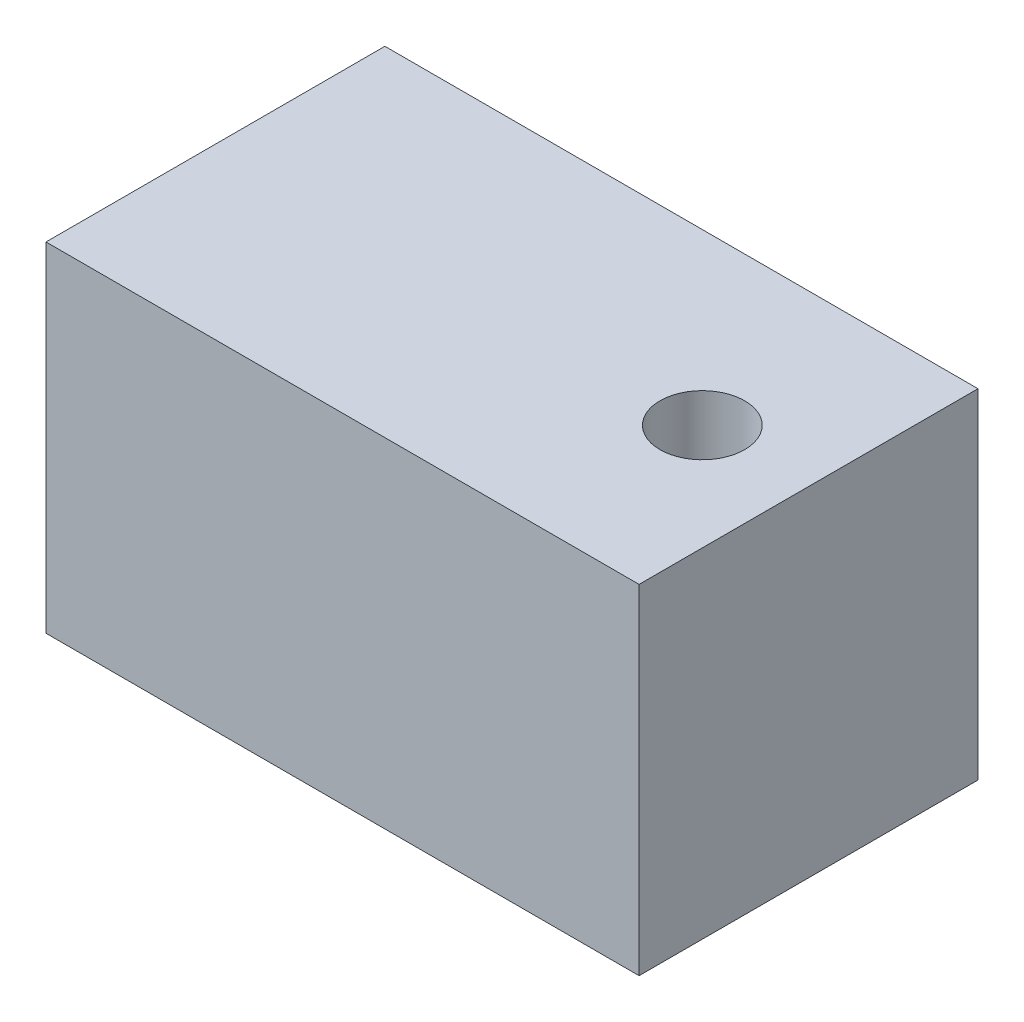
ISO-10303-21;
HEADER;
FILE_DESCRIPTION(('STEP AP214'),'2;1');
FILE_NAME('part.step','',(''),(''),'','','');
FILE_SCHEMA(('AUTOMOTIVE_DESIGN { 1 0 10303 214 1 1 1 1 }'));
ENDSEC;
DATA;
#1=APPLICATION_CONTEXT('core data for automotive mechanical design processes');
#2=APPLICATION_PROTOCOL_DEFINITION('international standard','automotive_design',2000,#1);
#3=PRODUCT_CONTEXT('',#1,'mechanical');
#4=PRODUCT('Part','Part','',(#3));
#5=PRODUCT_RELATED_PRODUCT_CATEGORY('part','',(#4));
#6=PRODUCT_DEFINITION_FORMATION('','',#4);
#7=PRODUCT_DEFINITION_CONTEXT('part definition',#1,'design');
#8=PRODUCT_DEFINITION('design','',#6,#7);
#9=PRODUCT_DEFINITION_SHAPE('','',#8);
#10=(LENGTH_UNIT() NAMED_UNIT(*) SI_UNIT(.MILLI.,.METRE.));
#11=(NAMED_UNIT(*) PLANE_ANGLE_UNIT() SI_UNIT($,.RADIAN.));
#12=(NAMED_UNIT(*) SI_UNIT($,.STERADIAN.) SOLID_ANGLE_UNIT());
#13=UNCERTAINTY_MEASURE_WITH_UNIT(LENGTH_MEASURE(1.E-05),#10,'distance_accuracy_value','');
#14=(GEOMETRIC_REPRESENTATION_CONTEXT(3) GLOBAL_UNCERTAINTY_ASSIGNED_CONTEXT((#13)) GLOBAL_UNIT_ASSIGNED_CONTEXT((#10,
#11,#12)) REPRESENTATION_CONTEXT('',''));
#15=CARTESIAN_POINT('',(0.,0.,0.));
#16=DIRECTION('',(0.,0.,1.));
#17=DIRECTION('',(1.,0.,0.));
#18=AXIS2_PLACEMENT_3D('',#15,#16,#17);
#19=CARTESIAN_POINT('',(0.,25.4,0.));
#20=DIRECTION('',(1.,0.,0.));
#21=DIRECTION('',(0.,0.,-1.));
#22=AXIS2_PLACEMENT_3D('',#19,#20,#21);
#23=PLANE('',#22);
#24=CARTESIAN_POINT('',(0.,12.7,-12.7));
#25=DIRECTION('',(-1.,0.,0.));
#26=DIRECTION('',(0.,0.,1.));
#27=AXIS2_PLACEMENT_3D('',#24,#25,#26);
#28=CIRCLE('',#27,3.96874999999999);
#29=CARTESIAN_POINT('',(0.,12.7,-8.73125000000001));
#30=VERTEX_POINT('',#29);
#31=EDGE_CURVE('E113',#30,#30,#28,.T.);
#32=ORIENTED_EDGE('',*,*,#31,.F.);
#33=EDGE_LOOP('',(#32));
#34=FACE_BOUND('',#33,.T.);
#35=DIRECTION('',(0.,0.,1.));
#36=VECTOR('',#35,1.);
#37=CARTESIAN_POINT('',(0.,0.,0.));
#38=LINE('',#37,#36);
#39=CARTESIAN_POINT('',(0.,0.,-25.4));
#40=VERTEX_POINT('',#39);
#41=CARTESIAN_POINT('',(0.,0.,0.));
#42=VERTEX_POINT('',#41);
#43=EDGE_CURVE('E126',#40,#42,#38,.T.);
#44=ORIENTED_EDGE('',*,*,#43,.T.);
#45=DIRECTION('',(0.,-1.,0.));
#46=VECTOR('',#45,1.);
#47=CARTESIAN_POINT('',(0.,25.4,0.));
#48=LINE('',#47,#46);
#49=CARTESIAN_POINT('',(0.,25.4,0.));
#50=VERTEX_POINT('',#49);
#51=EDGE_CURVE('E11',#50,#42,#48,.T.);
#52=ORIENTED_EDGE('',*,*,#51,.F.);
#53=DIRECTION('',(0.,0.,1.));
#54=VECTOR('',#53,1.);
#55=CARTESIAN_POINT('',(0.,25.4,0.));
#56=LINE('',#55,#54);
#57=CARTESIAN_POINT('',(0.,25.4,-25.4));
#58=VERTEX_POINT('',#57);
#59=EDGE_CURVE('E128',#58,#50,#56,.T.);
#60=ORIENTED_EDGE('',*,*,#59,.F.);
#61=DIRECTION('',(0.,-1.,0.));
#62=VECTOR('',#61,1.);
#63=CARTESIAN_POINT('',(0.,25.4,-25.4));
#64=LINE('',#63,#62);
#65=EDGE_CURVE('E138',#58,#40,#64,.T.);
#66=ORIENTED_EDGE('',*,*,#65,.T.);
#67=EDGE_LOOP('',(#44,#52,#60,#66));
#68=FACE_BOUND('',#67,.T.);
#69=ADVANCED_FACE('F49',(#34,#68),#23,.F.);
#70=CARTESIAN_POINT('',(0.,25.4,0.));
#71=DIRECTION('',(0.,0.,-1.));
#72=DIRECTION('',(-1.,0.,0.));
#73=AXIS2_PLACEMENT_3D('',#70,#71,#72);
#74=PLANE('',#73);
#75=DIRECTION('',(1.,0.,0.));
#76=VECTOR('',#75,1.);
#77=CARTESIAN_POINT('',(0.,0.,0.));
#78=LINE('',#77,#76);
#79=CARTESIAN_POINT('',(44.45,0.,0.));
#80=VERTEX_POINT('',#79);
#81=EDGE_CURVE('E142',#42,#80,#78,.T.);
#82=ORIENTED_EDGE('',*,*,#81,.T.);
#83=DIRECTION('',(0.,-1.,0.));
#84=VECTOR('',#83,1.);
#85=CARTESIAN_POINT('',(44.45,25.4,0.));
#86=LINE('',#85,#84);
#87=CARTESIAN_POINT('',(44.45,25.4,0.));
#88=VERTEX_POINT('',#87);
#89=EDGE_CURVE('E58',#88,#80,#86,.T.);
#90=ORIENTED_EDGE('',*,*,#89,.F.);
#91=DIRECTION('',(1.,0.,0.));
#92=VECTOR('',#91,1.);
#93=CARTESIAN_POINT('',(0.,25.4,0.));
#94=LINE('',#93,#92);
#95=EDGE_CURVE('E97',#50,#88,#94,.T.);
#96=ORIENTED_EDGE('',*,*,#95,.F.);
#97=ORIENTED_EDGE('',*,*,#51,.T.);
#98=EDGE_LOOP('',(#82,#90,#96,#97));
#99=FACE_BOUND('',#98,.T.);
#100=ADVANCED_FACE('F173',(#99),#74,.F.);
#101=CARTESIAN_POINT('',(44.45,25.4,0.));
#102=DIRECTION('',(-1.,0.,0.));
#103=DIRECTION('',(0.,0.,1.));
#104=AXIS2_PLACEMENT_3D('',#101,#102,#103);
#105=PLANE('',#104);
#106=DIRECTION('',(0.,0.,-1.));
#107=VECTOR('',#106,1.);
#108=CARTESIAN_POINT('',(44.45,0.,0.));
#109=LINE('',#108,#107);
#110=CARTESIAN_POINT('',(44.45,0.,-25.4));
#111=VERTEX_POINT('',#110);
#112=EDGE_CURVE('E84',#80,#111,#109,.T.);
#113=ORIENTED_EDGE('',*,*,#112,.T.);
#114=DIRECTION('',(0.,-1.,0.));
#115=VECTOR('',#114,1.);
#116=CARTESIAN_POINT('',(44.45,25.4,-25.4));
#117=LINE('',#116,#115);
#118=CARTESIAN_POINT('',(44.45,25.4,-25.4));
#119=VERTEX_POINT('',#118);
#120=EDGE_CURVE('E151',#119,#111,#117,.T.);
#121=ORIENTED_EDGE('',*,*,#120,.F.);
#122=DIRECTION('',(0.,0.,-1.));
#123=VECTOR('',#122,1.);
#124=CARTESIAN_POINT('',(44.45,25.4,0.));
#125=LINE('',#124,#123);
#126=EDGE_CURVE('E133',#88,#119,#125,.T.);
#127=ORIENTED_EDGE('',*,*,#126,.F.);
#128=ORIENTED_EDGE('',*,*,#89,.T.);
#129=EDGE_LOOP('',(#113,#121,#127,#128));
#130=FACE_BOUND('',#129,.T.);
#131=ADVANCED_FACE('F156',(#130),#105,.F.);
#132=CARTESIAN_POINT('',(0.,25.4,-25.4));
#133=DIRECTION('',(0.,0.,1.));
#134=DIRECTION('',(1.,0.,0.));
#135=AXIS2_PLACEMENT_3D('',#132,#133,#134);
#136=PLANE('',#135);
#137=DIRECTION('',(-1.,0.,0.));
#138=VECTOR('',#137,1.);
#139=CARTESIAN_POINT('',(0.,0.,-25.4));
#140=LINE('',#139,#138);
#141=EDGE_CURVE('E90',#111,#40,#140,.T.);
#142=ORIENTED_EDGE('',*,*,#141,.T.);
#143=ORIENTED_EDGE('',*,*,#65,.F.);
#144=DIRECTION('',(-1.,0.,0.));
#145=VECTOR('',#144,1.);
#146=CARTESIAN_POINT('',(0.,25.4,-25.4));
#147=LINE('',#146,#145);
#148=EDGE_CURVE('E66',#119,#58,#147,.T.);
#149=ORIENTED_EDGE('',*,*,#148,.F.);
#150=ORIENTED_EDGE('',*,*,#120,.T.);
#151=EDGE_LOOP('',(#142,#143,#149,#150));
#152=FACE_BOUND('',#151,.T.);
#153=ADVANCED_FACE('F163',(#152),#136,.F.);
#154=CARTESIAN_POINT('',(0.,25.4,0.));
#155=DIRECTION('',(0.,-1.,0.));
#156=DIRECTION('',(0.,0.,-1.));
#157=AXIS2_PLACEMENT_3D('',#154,#155,#156);
#158=PLANE('',#157);
#159=CARTESIAN_POINT('',(36.48842715,25.4,-12.7));
#160=DIRECTION('',(0.,1.,0.));
#161=DIRECTION('',(0.,0.,1.));
#162=AXIS2_PLACEMENT_3D('',#159,#160,#161);
#163=CIRCLE('',#162,3.175);
#164=CARTESIAN_POINT('',(36.48842715,25.4,-9.525));
#165=VERTEX_POINT('',#164);
#166=EDGE_CURVE('E112',#165,#165,#163,.T.);
#167=ORIENTED_EDGE('',*,*,#166,.F.);
#168=EDGE_LOOP('',(#167));
#169=FACE_BOUND('',#168,.T.);
#170=ORIENTED_EDGE('',*,*,#59,.T.);
#171=ORIENTED_EDGE('',*,*,#95,.T.);
#172=ORIENTED_EDGE('',*,*,#126,.T.);
#173=ORIENTED_EDGE('',*,*,#148,.T.);
#174=EDGE_LOOP('',(#170,#171,#172,#173));
#175=FACE_BOUND('',#174,.T.);
#176=ADVANCED_FACE('F165',(#169,#175),#158,.F.);
#177=CARTESIAN_POINT('',(0.,0.,0.));
#178=DIRECTION('',(0.,-1.,0.));
#179=DIRECTION('',(0.,0.,-1.));
#180=AXIS2_PLACEMENT_3D('',#177,#178,#179);
#181=PLANE('',#180);
#182=CARTESIAN_POINT('',(36.48842715,0.,-12.7));
#183=DIRECTION('',(0.,1.,0.));
#184=DIRECTION('',(0.,0.,1.));
#185=AXIS2_PLACEMENT_3D('',#182,#183,#184);
#186=CIRCLE('',#185,3.175);
#187=CARTESIAN_POINT('',(36.48842715,0.,-9.525));
#188=VERTEX_POINT('',#187);
#189=EDGE_CURVE('E119',#188,#188,#186,.T.);
#190=ORIENTED_EDGE('',*,*,#189,.T.);
#191=EDGE_LOOP('',(#190));
#192=FACE_BOUND('',#191,.T.);
#193=ORIENTED_EDGE('',*,*,#43,.F.);
#194=ORIENTED_EDGE('',*,*,#141,.F.);
#195=ORIENTED_EDGE('',*,*,#112,.F.);
#196=ORIENTED_EDGE('',*,*,#81,.F.);
#197=EDGE_LOOP('',(#193,#194,#195,#196));
#198=FACE_BOUND('',#197,.T.);
#199=ADVANCED_FACE('F159',(#192,#198),#181,.T.);
#200=CARTESIAN_POINT('',(36.48842715,0.,-12.7));
#201=DIRECTION('',(0.,1.,0.));
#202=DIRECTION('',(0.,0.,1.));
#203=AXIS2_PLACEMENT_3D('',#200,#201,#202);
#204=CYLINDRICAL_SURFACE('',#203,3.175);
#205=ORIENTED_EDGE('',*,*,#189,.F.);
#206=EDGE_LOOP('',(#205));
#207=FACE_BOUND('',#206,.T.);
#208=ORIENTED_EDGE('',*,*,#166,.T.);
#209=EDGE_LOOP('',(#208));
#210=FACE_BOUND('',#209,.T.);
#211=ADVANCED_FACE('F105',(#207,#210),#204,.F.);
#212=CARTESIAN_POINT('',(25.4,12.7,-12.7));
#213=DIRECTION('',(-1.,0.,0.));
#214=DIRECTION('',(0.,0.,1.));
#215=AXIS2_PLACEMENT_3D('',#212,#213,#214);
#216=CONICAL_SURFACE('',#215,3.96875,1.02974425867665);
#217=CARTESIAN_POINT('',(27.7846655817656,12.7,-12.7));
#218=VERTEX_POINT('',#217);
#219=VERTEX_LOOP('',#218);
#220=FACE_BOUND('',#219,.T.);
#221=CARTESIAN_POINT('',(25.4,12.7,-12.7));
#222=DIRECTION('',(-1.,0.,0.));
#223=DIRECTION('',(0.,0.,1.));
#224=AXIS2_PLACEMENT_3D('',#221,#222,#223);
#225=CIRCLE('',#224,3.96875);
#226=CARTESIAN_POINT('',(25.4,12.7,-8.73125));
#227=VERTEX_POINT('',#226);
#228=EDGE_CURVE('E109',#227,#227,#225,.T.);
#229=ORIENTED_EDGE('',*,*,#228,.T.);
#230=EDGE_LOOP('',(#229));
#231=FACE_BOUND('',#230,.T.);
#232=ADVANCED_FACE('F101',(#220,#231),#216,.F.);
#233=CARTESIAN_POINT('',(0.,12.7,-12.7));
#234=DIRECTION('',(-1.,0.,0.));
#235=DIRECTION('',(0.,0.,1.));
#236=AXIS2_PLACEMENT_3D('',#233,#234,#235);
#237=CYLINDRICAL_SURFACE('',#236,3.96874999999999);
#238=ORIENTED_EDGE('',*,*,#228,.F.);
#239=EDGE_LOOP('',(#238));
#240=FACE_BOUND('',#239,.T.);
#241=ORIENTED_EDGE('',*,*,#31,.T.);
#242=EDGE_LOOP('',(#241));
#243=FACE_BOUND('',#242,.T.);
#244=ADVANCED_FACE('F104',(#240,#243),#237,.F.);
#245=CLOSED_SHELL('',(#69,#100,#131,#153,#176,#199,#211,#232,#244));
#246=MANIFOLD_SOLID_BREP('B2',#245);
#247=ADVANCED_BREP_SHAPE_REPRESENTATION('',(#18,#246),#14);
#248=SHAPE_DEFINITION_REPRESENTATION(#9,#247);
ENDSEC;
END-ISO-10303-21;
